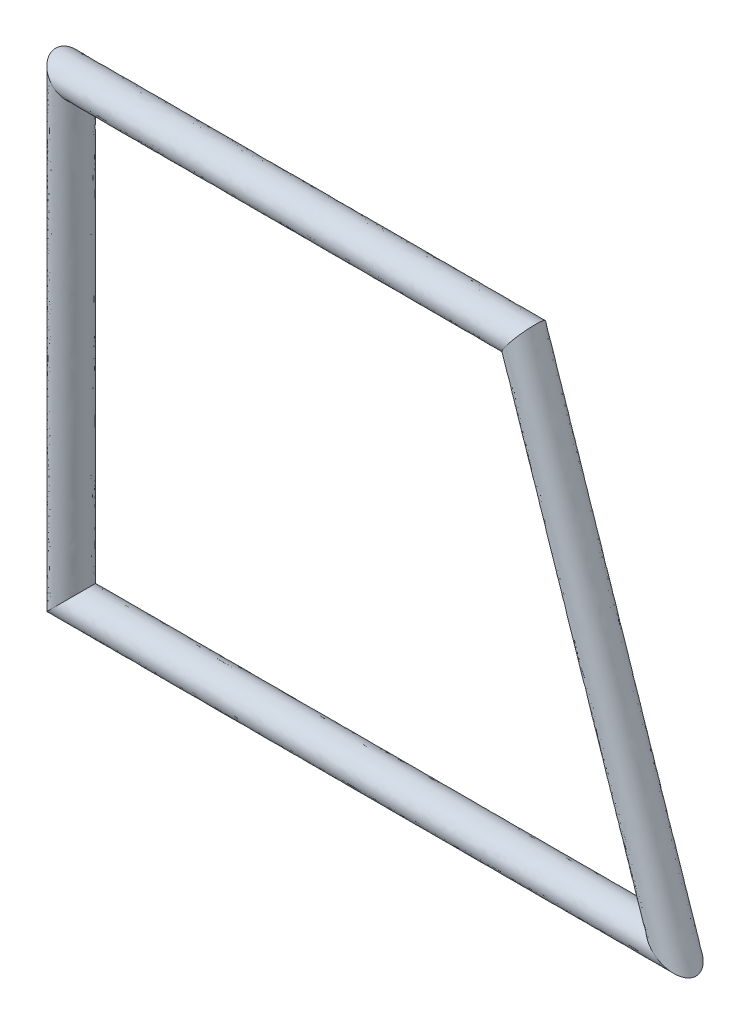
ISO-10303-21;
HEADER;
FILE_DESCRIPTION(('STEP AP214'),'2;1');
FILE_NAME('part.step','',(''),(''),'','','');
FILE_SCHEMA(('AUTOMOTIVE_DESIGN { 1 0 10303 214 1 1 1 1 }'));
ENDSEC;
DATA;
#1=APPLICATION_CONTEXT('core data for automotive mechanical design processes');
#2=APPLICATION_PROTOCOL_DEFINITION('international standard','automotive_design',2000,#1);
#3=PRODUCT_CONTEXT('',#1,'mechanical');
#4=PRODUCT('Part','Part','',(#3));
#5=PRODUCT_RELATED_PRODUCT_CATEGORY('part','',(#4));
#6=PRODUCT_DEFINITION_FORMATION('','',#4);
#7=PRODUCT_DEFINITION_CONTEXT('part definition',#1,'design');
#8=PRODUCT_DEFINITION('design','',#6,#7);
#9=PRODUCT_DEFINITION_SHAPE('','',#8);
#10=(LENGTH_UNIT() NAMED_UNIT(*) SI_UNIT(.MILLI.,.METRE.));
#11=(NAMED_UNIT(*) PLANE_ANGLE_UNIT() SI_UNIT($,.RADIAN.));
#12=(NAMED_UNIT(*) SI_UNIT($,.STERADIAN.) SOLID_ANGLE_UNIT());
#13=UNCERTAINTY_MEASURE_WITH_UNIT(LENGTH_MEASURE(1.E-05),#10,'distance_accuracy_value','');
#14=(GEOMETRIC_REPRESENTATION_CONTEXT(3) GLOBAL_UNCERTAINTY_ASSIGNED_CONTEXT((#13)) GLOBAL_UNIT_ASSIGNED_CONTEXT((#10,
#11,#12)) REPRESENTATION_CONTEXT('',''));
#15=CARTESIAN_POINT('',(0.,0.,0.));
#16=DIRECTION('',(0.,0.,1.));
#17=DIRECTION('',(1.,0.,0.));
#18=AXIS2_PLACEMENT_3D('',#15,#16,#17);
#19=CARTESIAN_POINT('',(0.0205548047910941,0.814230249470758,0.));
#20=CARTESIAN_POINT('',(0.0205548047910941,-0.185769750529242,0.));
#21=CARTESIAN_POINT('',(0.0205548047910941,0.814230249470758,0.05));
#22=CARTESIAN_POINT('',(0.0205548047910941,-0.185769750529242,0.05));
#23=CARTESIAN_POINT('',(-0.020554804791095,0.785769750529243,0.05));
#24=CARTESIAN_POINT('',(-0.020554804791095,-0.214230249470758,0.05));
#25=CARTESIAN_POINT('',(-0.0205548047910948,0.785769750529242,0.));
#26=CARTESIAN_POINT('',(-0.0205548047910948,-0.214230249470758,0.));
#27=CARTESIAN_POINT('',(-0.020554804791095,0.785769750529243,-0.05));
#28=CARTESIAN_POINT('',(-0.020554804791095,-0.214230249470758,-0.05));
#29=CARTESIAN_POINT('',(0.0205548047910941,0.814230249470758,-0.05));
#30=CARTESIAN_POINT('',(0.0205548047910941,-0.185769750529242,-0.05));
#31=CARTESIAN_POINT('',(0.0205548047910941,0.814230249470758,0.));
#32=CARTESIAN_POINT('',(0.0205548047910941,-0.185769750529242,0.));
#33=(BOUNDED_SURFACE() B_SPLINE_SURFACE(3,1,((#19,#20),(#21,#22),(#23,#24),(#25,#26),(#27,#28),
(#29,#30),(#31,#32)),.UNSPECIFIED.,.T.,.F.,.F.) B_SPLINE_SURFACE_WITH_KNOTS((4,3,4),(2,2),(0.,
0.5,1.),(0.,1.),.UNSPECIFIED.) GEOMETRIC_REPRESENTATION_ITEM() RATIONAL_B_SPLINE_SURFACE(((1.,
1.),(0.333333333333333,0.333333333333333),(0.333333333333333,0.333333333333333),(1.,1.),
(0.333333333333333,0.333333333333333),(0.333333333333333,0.333333333333333),(1.,1.))) REPRESENTATION_ITEM('') SURFACE());
#34=CARTESIAN_POINT('',(0.0205548047910941,0.579445195208906,0.));
#35=CARTESIAN_POINT('',(0.0205532310207258,0.579446768979413,-0.0024745087316732));
#36=CARTESIAN_POINT('',(0.0202456628507124,0.579754337149874,-0.00495462502400112));
#37=CARTESIAN_POINT('',(0.0190782622715015,0.580921737727913,-0.00962167584969162));
#38=CARTESIAN_POINT('',(0.0182195244829131,0.581780475514887,-0.0118091811248839));
#39=CARTESIAN_POINT('',(0.0160171915823935,0.583982808419962,-0.0158688794204982));
#40=CARTESIAN_POINT('',(0.0146435153670448,0.585356484642042,-0.0177076836963937));
#41=CARTESIAN_POINT('',(0.0113972454376633,0.58860275457247,-0.0209829893077553));
#42=CARTESIAN_POINT('',(0.00948278937542134,0.590517210627278,-0.0223347350284815));
#43=CARTESIAN_POINT('',(0.00519290710649878,0.594807092890443,-0.0243720872719921));
#44=CARTESIAN_POINT('',(0.00279027513298676,0.597209724867021,-0.0249408235001694));
#45=CARTESIAN_POINT('',(-0.00225381911586528,0.602253819115863,-0.025055724243426));
#46=CARTESIAN_POINT('',(-0.00489651463138013,0.604896514627698,-0.0245008098817776));
#47=CARTESIAN_POINT('',(-0.00992033166025754,0.609920331656104,-0.0221386329435371));
#48=CARTESIAN_POINT('',(-0.0122999283008012,0.612299928299894,-0.0203244723401726));
#49=CARTESIAN_POINT('',(-0.0158778989251529,0.615877898925841,-0.0160916927030805));
#50=CARTESIAN_POINT('',(-0.0172227270084605,0.617222727008488,-0.0139236432585702));
#51=CARTESIAN_POINT('',(-0.0192995858932146,0.619299585893186,-0.0090285886839972));
#52=CARTESIAN_POINT('',(-0.0200289741061865,0.620028974106769,-0.00629923511027768));
#53=CARTESIAN_POINT('',(-0.0206461375701878,0.620646137569659,-0.000957358602236128));
#54=CARTESIAN_POINT('',(-0.020616190480236,0.620616190478231,0.00163602207147679));
#55=CARTESIAN_POINT('',(-0.0199430338779747,0.619943033879881,0.00651910301338885));
#56=CARTESIAN_POINT('',(-0.019329976809602,0.619329976816564,0.00881745937422476));
#57=CARTESIAN_POINT('',(-0.0176058261759472,0.617605826168667,0.013134466221373));
#58=CARTESIAN_POINT('',(-0.0164732296676358,0.616473229639934,0.0151355085181095));
#59=CARTESIAN_POINT('',(-0.0137155046452455,0.613715504614076,0.0188042908033153));
#60=CARTESIAN_POINT('',(-0.0120491366467033,0.612049136636981,0.0204086650456726));
#61=CARTESIAN_POINT('',(-0.00822434462216462,0.608224344631151,0.0230898274879481));
#62=CARTESIAN_POINT('',(-0.00602968676913372,0.606029686771568,0.024061042469855));
#63=CARTESIAN_POINT('',(-0.00126739527523818,0.601267395272264,0.0251461253208022));
#64=CARTESIAN_POINT('',(0.00131337747598928,0.598686622523199,0.0251430204183163));
#65=CARTESIAN_POINT('',(0.00647538010933929,0.593524619891521,0.0239516121949781));
#66=CARTESIAN_POINT('',(0.00905006144704993,0.590949938553179,0.0227035097640057));
#67=CARTESIAN_POINT('',(0.0135876584610443,0.586412341538739,0.0190331439390966));
#68=CARTESIAN_POINT('',(0.0155752941450513,0.584424705854876,0.0166748210647139));
#69=CARTESIAN_POINT('',(0.0184665868117629,0.581533413188302,0.0113609286293151));
#70=CARTESIAN_POINT('',(0.0194819267978691,0.580518073202208,0.00853256630395429));
#71=CARTESIAN_POINT('',(0.0203825545547308,0.579617445445236,0.00373548767370038));
#72=CARTESIAN_POINT('',(0.0205559936808493,0.579444006319046,0.00186934392690438));
#73=CARTESIAN_POINT('',(0.0205548047910941,0.579445195208906,0.));
#74=B_SPLINE_CURVE_WITH_KNOTS('',3,(#34,#35,#36,#37,#38,#39,#40,#41,#42,#43,#44,#45,#46,#47,#48,
#49,#50,#51,#52,#53,#54,#55,#56,#57,#58,#59,#60,#61,#62,#63,#64,#65,#66,#67,#68,#69,#70,#71,#72,
#73),.UNSPECIFIED.,.T.,.F.,(4,2,2,2,2,2,2,2,2,2,2,2,2,2,2,2,2,2,2,4),(0.,0.00739913834662592,
0.0147836273133816,0.0226921124702387,0.0316410607253961,0.0418180717562661,0.052951107148381,
0.0641456145223177,0.0726458285996919,0.081182357979766,0.0887983016401835,0.0960406848418551,
0.103614422480346,0.112045450281635,0.121659111986691,0.132427344216017,0.143738958744166,
0.154466627741379,0.163714950471289,0.169304558685457),.UNSPECIFIED.);
#75=CARTESIAN_POINT('',(0.0205548047910941,0.579445195208906,0.));
#76=VERTEX_POINT('',#75);
#77=EDGE_CURVE('E68',#76,#76,#74,.T.);
#78=CARTESIAN_POINT('',(0.0205548047910941,0.0205548047910941,0.));
#79=CARTESIAN_POINT('',(0.0205532310206141,0.0205532310206251,-0.00247450873161359));
#80=CARTESIAN_POINT('',(0.0202456628503138,0.0202456628503022,-0.00495462502381359));
#81=CARTESIAN_POINT('',(0.019078262271899,0.0190782622719107,-0.00962167584987883));
#82=CARTESIAN_POINT('',(0.0182195244843909,0.0182195244844485,-0.0118091811255726));
#83=CARTESIAN_POINT('',(0.0160171915814632,0.0160171915814016,-0.0158688794185579));
#84=CARTESIAN_POINT('',(0.0146435153625193,0.0146435153622773,-0.0177076836914468));
#85=CARTESIAN_POINT('',(0.0113972454312046,0.0113972454314785,-0.0209829893044424));
#86=CARTESIAN_POINT('',(0.00948278937112158,0.00948278937221009,-0.0223347350292121));
#87=CARTESIAN_POINT('',(0.00519290710633211,0.00519290710502979,-0.0243720872735873));
#88=CARTESIAN_POINT('',(0.00279027513459977,0.00279027512952493,-0.0249408234995849));
#89=CARTESIAN_POINT('',(-0.002253819121478,-0.00225381911595753,-0.0250557242441539));
#90=CARTESIAN_POINT('',(-0.00489651464660758,-0.00489651462498189,-0.0245008098843205));
#91=CARTESIAN_POINT('',(-0.00992033167734998,-0.00992033165588723,-0.0221386329423659));
#92=CARTESIAN_POINT('',(-0.0122999283103363,-0.012299928305321,-0.0203244723346688));
#93=CARTESIAN_POINT('',(-0.0158778989293727,-0.0158778989331803,-0.0160916926936994));
#94=CARTESIAN_POINT('',(-0.0172227270130081,-0.0172227270140321,-0.0139236432490174));
#95=CARTESIAN_POINT('',(-0.0192995858970782,-0.0192995858960483,-0.00902858867376032));
#96=CARTESIAN_POINT('',(-0.020028974109033,-0.0200289741087478,-0.00629923509952737));
#97=CARTESIAN_POINT('',(-0.0206461375699787,-0.0206461375701849,-0.00095735859198266));
#98=CARTESIAN_POINT('',(-0.0206161904781268,-0.0206161904781788,0.00163602208086691));
#99=CARTESIAN_POINT('',(-0.0199430338773844,-0.019943033877335,0.0065191030232675));
#100=CARTESIAN_POINT('',(-0.0193299768120979,-0.0193299768120916,0.0088174593853426));
#101=CARTESIAN_POINT('',(-0.0176058261687558,-0.0176058261687626,0.0131344662212086));
#102=CARTESIAN_POINT('',(-0.0164732296481419,-0.0164732296481151,0.0151355085061254));
#103=CARTESIAN_POINT('',(-0.0137155046204985,-0.0137155046205282,0.0188042907959673));
#104=CARTESIAN_POINT('',(-0.0120491366295859,-0.0120491366297201,0.0204086650522447));
#105=CARTESIAN_POINT('',(-0.00822434461295697,-0.00822434461280398,0.0230898274991127));
#106=CARTESIAN_POINT('',(-0.00602968675919173,-0.00602968675857553,0.0240610424747839));
#107=CARTESIAN_POINT('',(-0.00126739526497005,-0.00126739526429244,0.0251461253204118));
#108=CARTESIAN_POINT('',(0.00131337748536354,0.00131337748552878,0.025143020417401));
#109=CARTESIAN_POINT('',(0.00647538011786522,0.00647538011764458,0.0239516121917094));
#110=CARTESIAN_POINT('',(0.00905006145569792,0.00905006145563731,0.0227035097589662));
#111=CARTESIAN_POINT('',(0.0135876584685825,0.01358765846864,0.0190331439311501));
#112=CARTESIAN_POINT('',(0.0155752941514821,0.0155752941515077,0.016674821055809));
#113=CARTESIAN_POINT('',(0.0184665868158521,0.0184665868158167,0.0113609286193528));
#114=CARTESIAN_POINT('',(0.0194819268007988,0.0194819268007346,0.00853256629387662));
#115=CARTESIAN_POINT('',(0.0203825545554252,0.0203825545553893,0.00373548766691974));
#116=CARTESIAN_POINT('',(0.0205559936809316,0.0205559936809233,0.0018693439234888));
#117=CARTESIAN_POINT('',(0.0205548047910941,0.0205548047910941,0.));
#118=B_SPLINE_CURVE_WITH_KNOTS('',3,(#78,#79,#80,#81,#82,#83,#84,#85,#86,#87,#88,#89,#90,#91,
#92,#93,#94,#95,#96,#97,#98,#99,#100,#101,#102,#103,#104,#105,#106,#107,#108,#109,#110,#111,
#112,#113,#114,#115,#116,#117),.UNSPECIFIED.,.T.,.F.,(4,2,2,2,2,2,2,2,2,2,2,2,2,2,2,2,2,2,2,4),
(0.,0.00739913834662598,0.0147836273133817,0.0226921124657073,0.0316410607305094,
0.0418180717545191,0.0529511071592144,0.0641456145347489,0.0726458286112579,0.0811823579904578,
0.0887983016498888,0.0960406848515677,0.103614422470354,0.112045450306419,0.121659111993982,
0.132427344224783,0.14373895875337,0.15446662774921,0.163714950477214,0.169304558681303),.UNSPECIFIED.);
#119=CARTESIAN_POINT('',(0.0205548047910941,0.0205548047910941,0.));
#120=VERTEX_POINT('',#119);
#121=EDGE_CURVE('E50',#120,#120,#118,.T.);
#122=ORIENTED_EDGE('',*,*,#77,.F.);
#123=EDGE_LOOP('',(#122));
#124=FACE_BOUND('',#123,.T.);
#125=ORIENTED_EDGE('',*,*,#121,.T.);
#126=EDGE_LOOP('',(#125));
#127=FACE_BOUND('',#126,.T.);
#128=ADVANCED_FACE('F45',(#124,#127),#33,.T.);
#129=CARTESIAN_POINT('',(-0.214230249470758,0.0205548047910941,0.));
#130=CARTESIAN_POINT('',(0.985769750529242,0.0205548047910941,0.));
#131=CARTESIAN_POINT('',(-0.214230249470758,0.0205548047910941,0.05));
#132=CARTESIAN_POINT('',(0.985769750529242,0.0205548047910941,0.05));
#133=CARTESIAN_POINT('',(-0.185769750529243,-0.020554804791095,0.05));
#134=CARTESIAN_POINT('',(1.01423024947076,-0.020554804791095,0.05));
#135=CARTESIAN_POINT('',(-0.185769750529243,-0.0205548047910948,0.));
#136=CARTESIAN_POINT('',(1.01423024947076,-0.0205548047910948,0.));
#137=CARTESIAN_POINT('',(-0.185769750529243,-0.020554804791095,-0.05));
#138=CARTESIAN_POINT('',(1.01423024947076,-0.020554804791095,-0.05));
#139=CARTESIAN_POINT('',(-0.214230249470758,0.0205548047910941,-0.05));
#140=CARTESIAN_POINT('',(0.985769750529242,0.0205548047910941,-0.05));
#141=CARTESIAN_POINT('',(-0.214230249470758,0.0205548047910941,0.));
#142=CARTESIAN_POINT('',(0.985769750529242,0.0205548047910941,0.));
#143=(BOUNDED_SURFACE() B_SPLINE_SURFACE(3,1,((#129,#130),(#131,#132),(#133,#134),(#135,#136),
(#137,#138),(#139,#140),(#141,#142)),.UNSPECIFIED.,.T.,.F.,.F.) B_SPLINE_SURFACE_WITH_KNOTS((4,
3,4),(2,2),(0.,0.5,1.),(0.,1.),
.UNSPECIFIED.) GEOMETRIC_REPRESENTATION_ITEM() RATIONAL_B_SPLINE_SURFACE(((1.,1.),
(0.333333333333333,0.333333333333333),(0.333333333333333,0.333333333333333),(1.,1.),
(0.333333333333333,0.333333333333333),(0.333333333333333,0.333333333333333),(1.,1.))) REPRESENTATION_ITEM('') SURFACE());
#144=CARTESIAN_POINT('',(0.771481731736302,0.0205548047910942,0.));
#145=CARTESIAN_POINT('',(0.771483321402861,0.0205536590242618,-0.00212662330442987));
#146=CARTESIAN_POINT('',(0.771803403927012,0.0203229565938004,-0.00426759769243637));
#147=CARTESIAN_POINT('',(0.772983918709045,0.0194720896802462,-0.0082754504045208));
#148=CARTESIAN_POINT('',(0.773842228264002,0.0188534551548583,-0.0101433701028791));
#149=CARTESIAN_POINT('',(0.776374033718939,0.0170286330297896,-0.0142713494881944));
#150=CARTESIAN_POINT('',(0.778239833950291,0.0156838403101903,-0.0163464693464997));
#151=CARTESIAN_POINT('',(0.78311745448355,0.0121682503391231,-0.0204425106611309));
#152=CARTESIAN_POINT('',(0.786295219692676,0.0098778467658997,-0.0221424645027955));
#153=CARTESIAN_POINT('',(0.793789386768295,0.0044763567482505,-0.0247182585019854));
#154=CARTESIAN_POINT('',(0.798179588548603,0.00131207833489361,-0.0252417971952724));
#155=CARTESIAN_POINT('',(0.806919247017279,-0.0049871110865222,-0.0245580174499944));
#156=CARTESIAN_POINT('',(0.811268248579977,-0.00812169405852822,-0.0233393412987216));
#157=CARTESIAN_POINT('',(0.817835068280427,-0.012854789903046,-0.0196879655485425));
#158=CARTESIAN_POINT('',(0.820259155662224,-0.014601973234007,-0.0178446055177889));
#159=CARTESIAN_POINT('',(0.823957612882683,-0.0172676703758034,-0.0137472225706229));
#160=CARTESIAN_POINT('',(0.825368295611421,-0.0182844329590624,-0.0116914434217759));
#161=CARTESIAN_POINT('',(0.827303633470221,-0.0196793455646842,-0.00749710231373549));
#162=CARTESIAN_POINT('',(0.827943512120701,-0.0201405440017437,-0.00544326888439809));
#163=CARTESIAN_POINT('',(0.828591788417949,-0.0206077951201357,-0.00117083953494745));
#164=CARTESIAN_POINT('',(0.828597864267754,-0.0206121743448991,0.00104833237541196));
#165=CARTESIAN_POINT('',(0.827995937698455,-0.0201783302202766,0.00517072726239669));
#166=CARTESIAN_POINT('',(0.827434379824692,-0.0197735822051668,0.00708515083849206));
#167=CARTESIAN_POINT('',(0.825653920090676,-0.0184902994359402,0.0112045133409162));
#168=CARTESIAN_POINT('',(0.824281742127335,-0.0175012895173098,0.0133050249314627));
#169=CARTESIAN_POINT('',(0.820571135378703,-0.0148268354912117,0.0175934074922003));
#170=CARTESIAN_POINT('',(0.818062648048159,-0.0130188201192927,0.0195437516458263));
#171=CARTESIAN_POINT('',(0.811781135998182,-0.00849136239348824,0.023077238540303));
#172=CARTESIAN_POINT('',(0.80787618779665,-0.00567683497360737,0.0242813495732314));
#173=CARTESIAN_POINT('',(0.799887842838607,8.08383084534152E-05,0.0252532890093407));
#174=CARTESIAN_POINT('',(0.795802445029961,0.00302542644742917,0.0249922892967789));
#175=CARTESIAN_POINT('',(0.788322694696715,0.00841652546370603,0.023033772170112));
#176=CARTESIAN_POINT('',(0.784902447871685,0.0108816998969725,0.0215020898518815));
#177=CARTESIAN_POINT('',(0.779611261383026,0.0146953713433488,0.0176561008514775));
#178=CARTESIAN_POINT('',(0.777578848796684,0.0161602514540302,0.0156982730686628));
#179=CARTESIAN_POINT('',(0.774574336140401,0.0183257816528848,0.0115249587164866));
#180=CARTESIAN_POINT('',(0.773466717506265,0.0191241079957232,0.00946532453196665));
#181=CARTESIAN_POINT('',(0.772038433529976,0.0201535568404798,0.0052994132683941));
#182=CARTESIAN_POINT('',(0.771625974318242,0.0204508406202398,0.0032445647753484));
#183=CARTESIAN_POINT('',(0.771492011613901,0.0205473954745353,0.000785159527107282));
#184=CARTESIAN_POINT('',(0.771481438097027,0.0205550164343096,0.000392824597091366));
#185=CARTESIAN_POINT('',(0.771481731736302,0.0205548047910942,0.));
#186=B_SPLINE_CURVE_WITH_KNOTS('',3,(#144,#145,#146,#147,#148,#149,#150,#151,#152,#153,#154,
#155,#156,#157,#158,#159,#160,#161,#162,#163,#164,#165,#166,#167,#168,#169,#170,#171,#172,#173,
#174,#175,#176,#177,#178,#179,#180,#181,#182,#183,#184,#185),.UNSPECIFIED.,.T.,.F.,(4,2,2,2,2,2,
2,2,2,2,2,2,2,2,2,2,2,2,2,2,4),(0.,0.00637559652737983,0.0127262052561681,0.0218499311343946,
0.0344447249692148,0.0504823707697706,0.0666250459598638,0.0770000301516103,0.0849373932878607,
0.0914152651146374,0.0979168663678438,0.103926363865591,0.111867588198401,0.122649479929602,
0.137276654026917,0.152192634524435,0.165421354952503,0.174808180421669,0.182093177283529,
0.18830654879302,0.189484233215018),.UNSPECIFIED.);
#187=CARTESIAN_POINT('',(0.771481731736302,0.0205548047910941,0.));
#188=VERTEX_POINT('',#187);
#189=EDGE_CURVE('E58',#188,#188,#186,.T.);
#190=ORIENTED_EDGE('',*,*,#121,.F.);
#191=EDGE_LOOP('',(#190));
#192=FACE_BOUND('',#191,.T.);
#193=ORIENTED_EDGE('',*,*,#189,.T.);
#194=EDGE_LOOP('',(#193));
#195=FACE_BOUND('',#194,.T.);
#196=ADVANCED_FACE('F85',(#192,#195),#143,.T.);
#197=CARTESIAN_POINT('',(0.814230249470758,0.579445195208906,0.));
#198=CARTESIAN_POINT('',(-0.185769750529242,0.579445195208906,0.));
#199=CARTESIAN_POINT('',(0.814230249470758,0.579445195208906,0.05));
#200=CARTESIAN_POINT('',(-0.185769750529242,0.579445195208906,0.05));
#201=CARTESIAN_POINT('',(0.785769750529243,0.620554804791095,0.05));
#202=CARTESIAN_POINT('',(-0.214230249470758,0.620554804791095,0.05));
#203=CARTESIAN_POINT('',(0.785769750529243,0.620554804791095,0.));
#204=CARTESIAN_POINT('',(-0.214230249470757,0.620554804791095,0.));
#205=CARTESIAN_POINT('',(0.785769750529243,0.620554804791095,-0.05));
#206=CARTESIAN_POINT('',(-0.214230249470758,0.620554804791095,-0.05));
#207=CARTESIAN_POINT('',(0.814230249470758,0.579445195208906,-0.05));
#208=CARTESIAN_POINT('',(-0.185769750529242,0.579445195208906,-0.05));
#209=CARTESIAN_POINT('',(0.814230249470758,0.579445195208906,0.));
#210=CARTESIAN_POINT('',(-0.185769750529242,0.579445195208906,0.));
#211=(BOUNDED_SURFACE() B_SPLINE_SURFACE(3,1,((#197,#198),(#199,#200),(#201,#202),(#203,#204),
(#205,#206),(#207,#208),(#209,#210)),.UNSPECIFIED.,.T.,.F.,.F.) B_SPLINE_SURFACE_WITH_KNOTS((4,
3,4),(2,2),(0.,0.5,1.),(0.,1.),
.UNSPECIFIED.) GEOMETRIC_REPRESENTATION_ITEM() RATIONAL_B_SPLINE_SURFACE(((1.,1.),
(0.333333333333333,0.333333333333333),(0.333333333333333,0.333333333333333),(1.,1.),
(0.333333333333333,0.333333333333333),(0.333333333333333,0.333333333333333),(1.,1.))) REPRESENTATION_ITEM('') SURFACE());
#212=CARTESIAN_POINT('',(0.585184934930365,0.579445195208906,0.));
#213=CARTESIAN_POINT('',(0.58518413232131,0.579444081648337,-0.00157184581854597));
#214=CARTESIAN_POINT('',(0.585272056213802,0.579566069532836,-0.0031395705787614));
#215=CARTESIAN_POINT('',(0.585756297346172,0.580237918215289,-0.00740742223862373));
#216=CARTESIAN_POINT('',(0.586337357445494,0.581044096038831,-0.01005434064225));
#217=CARTESIAN_POINT('',(0.587976551926858,0.583318356895663,-0.0148705580997029));
#218=CARTESIAN_POINT('',(0.589035469643294,0.584787526747371,-0.0170390641846988));
#219=CARTESIAN_POINT('',(0.591521549932769,0.5882367788974,-0.0206907500671906));
#220=CARTESIAN_POINT('',(0.592952706769472,0.590222402940526,-0.0221659763305185));
#221=CARTESIAN_POINT('',(0.596037096643557,0.594501765296737,-0.0242539298698131));
#222=CARTESIAN_POINT('',(0.597692967523137,0.596799163420376,-0.0248552308222896));
#223=CARTESIAN_POINT('',(0.601043994835252,0.601448465459744,-0.0250993286766953));
#224=CARTESIAN_POINT('',(0.602739372285789,0.603800676021561,-0.0247332844633584));
#225=CARTESIAN_POINT('',(0.605966219015073,0.608277686708592,-0.0230599270270475));
#226=CARTESIAN_POINT('',(0.607497463024906,0.610402174289891,-0.0217513387185592));
#227=CARTESIAN_POINT('',(0.610205647102186,0.614159578984663,-0.0183432351365468));
#228=CARTESIAN_POINT('',(0.611385043989637,0.615795904753856,-0.0162494463413235));
#229=CARTESIAN_POINT('',(0.613250044511457,0.618383454754283,-0.0115327876545334));
#230=CARTESIAN_POINT('',(0.613941654921021,0.619343012940871,-0.00891688177906521));
#231=CARTESIAN_POINT('',(0.614764393612044,0.62048450189942,-0.00347286257393098));
#232=CARTESIAN_POINT('',(0.614902310909757,0.620675851928292,-0.000647755013774398));
#233=CARTESIAN_POINT('',(0.614620440368286,0.620284777442145,0.0049006787839545));
#234=CARTESIAN_POINT('',(0.614204312233004,0.619707430495056,0.00762455195777819));
#235=CARTESIAN_POINT('',(0.612869953904766,0.617856107208509,0.012690301968871));
#236=CARTESIAN_POINT('',(0.611950733628344,0.616580757201623,0.015031413695356));
#237=CARTESIAN_POINT('',(0.609706269890591,0.613466730110086,0.0190922091062947));
#238=CARTESIAN_POINT('',(0.608377225737922,0.611622779847883,0.0208057326240395));
#239=CARTESIAN_POINT('',(0.605447322853311,0.60755775673995,0.0234184800341511));
#240=CARTESIAN_POINT('',(0.603843151127593,0.605332087360894,0.0243068139185177));
#241=CARTESIAN_POINT('',(0.600535267098376,0.600742643428719,0.0251442896852452));
#242=CARTESIAN_POINT('',(0.598830660481298,0.598377628081794,0.0250830901244622));
#243=CARTESIAN_POINT('',(0.595521556333348,0.593786491324239,0.0240002086672978));
#244=CARTESIAN_POINT('',(0.5939174917892,0.591560970650592,0.0229746413177592));
#245=CARTESIAN_POINT('',(0.591008250043405,0.587524613341752,0.0200711477915058));
#246=CARTESIAN_POINT('',(0.589701712274447,0.585711889020241,0.0181972237267943));
#247=CARTESIAN_POINT('',(0.587545898053707,0.582720856564232,0.0138324577517124));
#248=CARTESIAN_POINT('',(0.586691581428895,0.581535555563215,0.011348887906506));
#249=CARTESIAN_POINT('',(0.585500552661841,0.579883091419752,0.00591532097590318));
#250=CARTESIAN_POINT('',(0.585186441451127,0.579447285394787,0.00295040075078615));
#251=CARTESIAN_POINT('',(0.585184934930365,0.579445195208906,0.));
#252=B_SPLINE_CURVE_WITH_KNOTS('',3,(#212,#213,#214,#215,#216,#217,#218,#219,#220,#221,#222,
#223,#224,#225,#226,#227,#228,#229,#230,#231,#232,#233,#234,#235,#236,#237,#238,#239,#240,#241,
#242,#243,#244,#245,#246,#247,#248,#249,#250,#251),.UNSPECIFIED.,.T.,.F.,(4,2,2,2,2,2,2,2,2,2,2,
2,2,2,2,2,2,2,2,4),(0.,0.00470362396387131,0.0130130255220494,0.021336098136652,
0.0297524556470469,0.0382778943389514,0.0468815207159454,0.0554968081000763,0.0640504488045159,
0.0724968255674556,0.0808393162506766,0.0891269737436902,0.0974310002720732,0.105814480004579,
0.114307086774672,0.122892251506162,0.131512154885819,0.140091811019324,0.148573715436986,
0.157402555715518),.UNSPECIFIED.);
#253=CARTESIAN_POINT('',(0.585184934930365,0.579445195208906,0.));
#254=VERTEX_POINT('',#253);
#255=EDGE_CURVE('E12',#254,#254,#252,.T.);
#256=ORIENTED_EDGE('',*,*,#255,.F.);
#257=EDGE_LOOP('',(#256));
#258=FACE_BOUND('',#257,.T.);
#259=ORIENTED_EDGE('',*,*,#77,.T.);
#260=EDGE_LOOP('',(#259));
#261=FACE_BOUND('',#260,.T.);
#262=ADVANCED_FACE('F75',(#258,#261),#211,.T.);
#263=CARTESIAN_POINT('',(0.848245553203368,-0.209736659610103,0.));
#264=CARTESIAN_POINT('',(0.521754446796633,0.769736659610103,0.));
#265=CARTESIAN_POINT('',(0.848245553203368,-0.209736659610103,0.05));
#266=CARTESIAN_POINT('',(0.521754446796633,0.769736659610103,0.05));
#267=CARTESIAN_POINT('',(0.878245553203368,-0.169736659610103,0.05));
#268=CARTESIAN_POINT('',(0.551754446796633,0.809736659610103,0.05));
#269=CARTESIAN_POINT('',(0.878245553203368,-0.169736659610103,0.));
#270=CARTESIAN_POINT('',(0.551754446796633,0.809736659610103,0.));
#271=CARTESIAN_POINT('',(0.878245553203368,-0.169736659610103,-0.05));
#272=CARTESIAN_POINT('',(0.551754446796633,0.809736659610103,-0.05));
#273=CARTESIAN_POINT('',(0.848245553203368,-0.209736659610103,-0.05));
#274=CARTESIAN_POINT('',(0.521754446796633,0.769736659610103,-0.05));
#275=CARTESIAN_POINT('',(0.848245553203368,-0.209736659610103,0.));
#276=CARTESIAN_POINT('',(0.521754446796633,0.769736659610103,0.));
#277=(BOUNDED_SURFACE() B_SPLINE_SURFACE(3,1,((#263,#264),(#265,#266),(#267,#268),(#269,#270),
(#271,#272),(#273,#274),(#275,#276)),.UNSPECIFIED.,.T.,.F.,.F.) B_SPLINE_SURFACE_WITH_KNOTS((4,
3,4),(2,2),(0.,0.5,1.),(0.,1.),
.UNSPECIFIED.) GEOMETRIC_REPRESENTATION_ITEM() RATIONAL_B_SPLINE_SURFACE(((1.,1.),
(0.333333333333333,0.333333333333333),(0.333333333333333,0.333333333333333),(1.,1.),
(0.333333333333333,0.333333333333333),(0.333333333333333,0.333333333333333),(1.,1.))) REPRESENTATION_ITEM('') SURFACE());
#278=ORIENTED_EDGE('',*,*,#189,.F.);
#279=EDGE_LOOP('',(#278));
#280=FACE_BOUND('',#279,.T.);
#281=ORIENTED_EDGE('',*,*,#255,.T.);
#282=EDGE_LOOP('',(#281));
#283=FACE_BOUND('',#282,.T.);
#284=ADVANCED_FACE('F78',(#280,#283),#277,.T.);
#285=CLOSED_SHELL('',(#128,#196,#262,#284));
#286=MANIFOLD_SOLID_BREP('B2',#285);
#287=ADVANCED_BREP_SHAPE_REPRESENTATION('',(#18,#286),#14);
#288=SHAPE_DEFINITION_REPRESENTATION(#9,#287);
ENDSEC;
END-ISO-10303-21;
